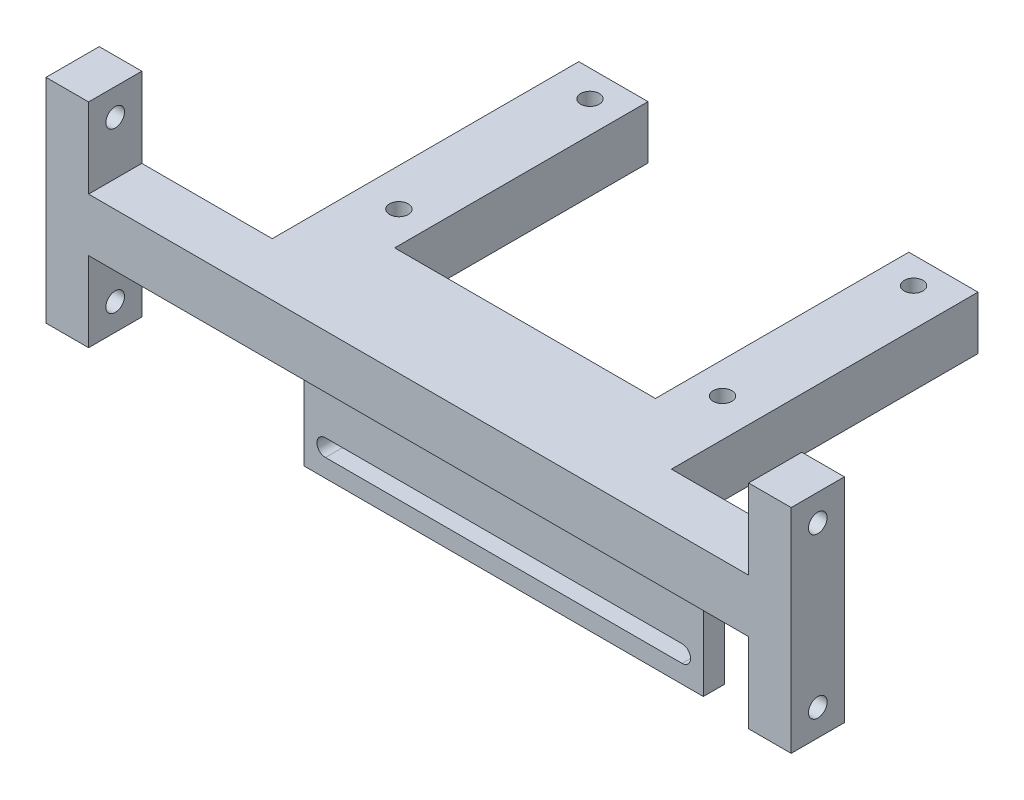
ISO-10303-21;
HEADER;
FILE_DESCRIPTION(('STEP AP214'),'2;1');
FILE_NAME('part.step','',(''),(''),'','','');
FILE_SCHEMA(('AUTOMOTIVE_DESIGN { 1 0 10303 214 1 1 1 1 }'));
ENDSEC;
DATA;
#1=APPLICATION_CONTEXT('core data for automotive mechanical design processes');
#2=APPLICATION_PROTOCOL_DEFINITION('international standard','automotive_design',2000,#1);
#3=PRODUCT_CONTEXT('',#1,'mechanical');
#4=PRODUCT('Part','Part','',(#3));
#5=PRODUCT_RELATED_PRODUCT_CATEGORY('part','',(#4));
#6=PRODUCT_DEFINITION_FORMATION('','',#4);
#7=PRODUCT_DEFINITION_CONTEXT('part definition',#1,'design');
#8=PRODUCT_DEFINITION('design','',#6,#7);
#9=PRODUCT_DEFINITION_SHAPE('','',#8);
#10=(LENGTH_UNIT() NAMED_UNIT(*) SI_UNIT(.MILLI.,.METRE.));
#11=(NAMED_UNIT(*) PLANE_ANGLE_UNIT() SI_UNIT($,.RADIAN.));
#12=(NAMED_UNIT(*) SI_UNIT($,.STERADIAN.) SOLID_ANGLE_UNIT());
#13=UNCERTAINTY_MEASURE_WITH_UNIT(LENGTH_MEASURE(1.E-05),#10,'distance_accuracy_value','');
#14=(GEOMETRIC_REPRESENTATION_CONTEXT(3) GLOBAL_UNCERTAINTY_ASSIGNED_CONTEXT((#13)) GLOBAL_UNIT_ASSIGNED_CONTEXT((#10,
#11,#12)) REPRESENTATION_CONTEXT('',''));
#15=CARTESIAN_POINT('',(0.,0.,0.));
#16=DIRECTION('',(0.,0.,1.));
#17=DIRECTION('',(1.,0.,0.));
#18=AXIS2_PLACEMENT_3D('',#15,#16,#17);
#19=CARTESIAN_POINT('',(0.,0.,60.));
#20=DIRECTION('',(0.,0.,-1.));
#21=DIRECTION('',(-1.,0.,0.));
#22=AXIS2_PLACEMENT_3D('',#19,#20,#21);
#23=PLANE('',#22);
#24=CARTESIAN_POINT('',(33.5,-30.,60.));
#25=DIRECTION('',(0.,0.,-1.));
#26=DIRECTION('',(-1.,0.,0.));
#27=AXIS2_PLACEMENT_3D('',#24,#25,#26);
#28=CIRCLE('',#27,1.6);
#29=CARTESIAN_POINT('',(33.5,-28.4,60.));
#30=VERTEX_POINT('',#29);
#31=CARTESIAN_POINT('',(33.5,-31.6,60.));
#32=VERTEX_POINT('',#31);
#33=EDGE_CURVE('E58',#30,#32,#28,.T.);
#34=ORIENTED_EDGE('',*,*,#33,.F.);
#35=DIRECTION('',(1.,0.,0.));
#36=VECTOR('',#35,1.);
#37=CARTESIAN_POINT('',(33.5,-28.4,60.));
#38=LINE('',#37,#36);
#39=CARTESIAN_POINT('',(-33.5,-28.4,60.));
#40=VERTEX_POINT('',#39);
#41=EDGE_CURVE('E311',#40,#30,#38,.T.);
#42=ORIENTED_EDGE('',*,*,#41,.F.);
#43=CARTESIAN_POINT('',(-33.5,-30.,60.));
#44=DIRECTION('',(0.,0.,-1.));
#45=DIRECTION('',(-1.,0.,0.));
#46=AXIS2_PLACEMENT_3D('',#43,#44,#45);
#47=CIRCLE('',#46,1.6);
#48=CARTESIAN_POINT('',(-33.5,-31.6,60.));
#49=VERTEX_POINT('',#48);
#50=EDGE_CURVE('E308',#49,#40,#47,.T.);
#51=ORIENTED_EDGE('',*,*,#50,.F.);
#52=DIRECTION('',(-1.,0.,0.));
#53=VECTOR('',#52,1.);
#54=CARTESIAN_POINT('',(33.5,-31.6,60.));
#55=LINE('',#54,#53);
#56=EDGE_CURVE('E306',#32,#49,#55,.T.);
#57=ORIENTED_EDGE('',*,*,#56,.F.);
#58=EDGE_LOOP('',(#34,#42,#51,#57));
#59=FACE_BOUND('',#58,.T.);
#60=DIRECTION('',(1.,0.,0.));
#61=VECTOR('',#60,1.);
#62=CARTESIAN_POINT('',(-37.5,-5.,60.));
#63=LINE('',#62,#61);
#64=CARTESIAN_POINT('',(-37.5,-5.,60.));
#65=VERTEX_POINT('',#64);
#66=CARTESIAN_POINT('',(-24.5,-5.,60.));
#67=VERTEX_POINT('',#66);
#68=EDGE_CURVE('E229',#65,#67,#63,.T.);
#69=ORIENTED_EDGE('',*,*,#68,.T.);
#70=DIRECTION('',(0.,-1.,0.));
#71=VECTOR('',#70,1.);
#72=CARTESIAN_POINT('',(-24.5,5.,60.));
#73=LINE('',#72,#71);
#74=CARTESIAN_POINT('',(-24.5,5.,60.));
#75=VERTEX_POINT('',#74);
#76=EDGE_CURVE('E232',#75,#67,#73,.T.);
#77=ORIENTED_EDGE('',*,*,#76,.F.);
#78=DIRECTION('',(1.,0.,0.));
#79=VECTOR('',#78,1.);
#80=CARTESIAN_POINT('',(27.5,5.,60.));
#81=LINE('',#80,#79);
#82=CARTESIAN_POINT('',(24.5,5.,60.));
#83=VERTEX_POINT('',#82);
#84=EDGE_CURVE('E423',#75,#83,#81,.T.);
#85=ORIENTED_EDGE('',*,*,#84,.T.);
#86=DIRECTION('',(0.,1.,0.));
#87=VECTOR('',#86,1.);
#88=CARTESIAN_POINT('',(24.5,-5.,60.));
#89=LINE('',#88,#87);
#90=CARTESIAN_POINT('',(24.5,-5.,60.));
#91=VERTEX_POINT('',#90);
#92=EDGE_CURVE('E258',#91,#83,#89,.T.);
#93=ORIENTED_EDGE('',*,*,#92,.F.);
#94=CARTESIAN_POINT('',(37.5,-5.,60.));
#95=VERTEX_POINT('',#94);
#96=EDGE_CURVE('E239',#91,#95,#63,.T.);
#97=ORIENTED_EDGE('',*,*,#96,.T.);
#98=DIRECTION('',(0.,1.,0.));
#99=VECTOR('',#98,1.);
#100=CARTESIAN_POINT('',(37.5,-35.,60.));
#101=LINE('',#100,#99);
#102=CARTESIAN_POINT('',(37.5,-35.,60.));
#103=VERTEX_POINT('',#102);
#104=EDGE_CURVE('E336',#103,#95,#101,.T.);
#105=ORIENTED_EDGE('',*,*,#104,.F.);
#106=DIRECTION('',(1.,0.,0.));
#107=VECTOR('',#106,1.);
#108=CARTESIAN_POINT('',(-37.5,-35.,60.));
#109=LINE('',#108,#107);
#110=CARTESIAN_POINT('',(-37.5,-35.,60.));
#111=VERTEX_POINT('',#110);
#112=EDGE_CURVE('E324',#111,#103,#109,.T.);
#113=ORIENTED_EDGE('',*,*,#112,.F.);
#114=DIRECTION('',(0.,1.,0.));
#115=VECTOR('',#114,1.);
#116=CARTESIAN_POINT('',(-37.5,-35.,60.));
#117=LINE('',#116,#115);
#118=EDGE_CURVE('E235',#111,#65,#117,.T.);
#119=ORIENTED_EDGE('',*,*,#118,.T.);
#120=EDGE_LOOP('',(#69,#77,#85,#93,#97,#105,#113,#119));
#121=FACE_BOUND('',#120,.T.);
#122=ADVANCED_FACE('F41',(#59,#121),#23,.T.);
#123=CARTESIAN_POINT('',(-70.,-5.,80.));
#124=DIRECTION('',(0.,1.,0.));
#125=DIRECTION('',(0.,0.,1.));
#126=AXIS2_PLACEMENT_3D('',#123,#124,#125);
#127=PLANE('',#126);
#128=CARTESIAN_POINT('',(-30.4,-5.,53.3));
#129=DIRECTION('',(0.,1.,0.));
#130=DIRECTION('',(0.,0.,1.));
#131=AXIS2_PLACEMENT_3D('',#128,#129,#130);
#132=CIRCLE('',#131,1.75);
#133=CARTESIAN_POINT('',(-30.4,-5.,55.05));
#134=VERTEX_POINT('',#133);
#135=EDGE_CURVE('E282',#134,#134,#132,.T.);
#136=ORIENTED_EDGE('',*,*,#135,.T.);
#137=EDGE_LOOP('',(#136));
#138=FACE_BOUND('',#137,.T.);
#139=CARTESIAN_POINT('',(-30.4,-5.,17.4));
#140=DIRECTION('',(0.,1.,0.));
#141=DIRECTION('',(0.,0.,1.));
#142=AXIS2_PLACEMENT_3D('',#139,#140,#141);
#143=CIRCLE('',#142,1.75);
#144=CARTESIAN_POINT('',(-30.4,-5.,19.15));
#145=VERTEX_POINT('',#144);
#146=EDGE_CURVE('E279',#145,#145,#143,.T.);
#147=ORIENTED_EDGE('',*,*,#146,.T.);
#148=EDGE_LOOP('',(#147));
#149=FACE_BOUND('',#148,.T.);
#150=ORIENTED_EDGE('',*,*,#68,.F.);
#151=DIRECTION('',(0.,0.,-1.));
#152=VECTOR('',#151,1.);
#153=CARTESIAN_POINT('',(-37.5,-5.,0.));
#154=LINE('',#153,#152);
#155=CARTESIAN_POINT('',(-37.5,-5.,12.4));
#156=VERTEX_POINT('',#155);
#157=EDGE_CURVE('E428',#65,#156,#154,.T.);
#158=ORIENTED_EDGE('',*,*,#157,.T.);
#159=DIRECTION('',(-1.,0.,0.));
#160=VECTOR('',#159,1.);
#161=CARTESIAN_POINT('',(-27.5,-5.,12.4));
#162=LINE('',#161,#160);
#163=CARTESIAN_POINT('',(-24.5,-5.,12.4));
#164=VERTEX_POINT('',#163);
#165=EDGE_CURVE('E245',#164,#156,#162,.T.);
#166=ORIENTED_EDGE('',*,*,#165,.F.);
#167=DIRECTION('',(0.,0.,-1.));
#168=VECTOR('',#167,1.);
#169=CARTESIAN_POINT('',(-24.5,-5.,60.));
#170=LINE('',#169,#168);
#171=EDGE_CURVE('E242',#67,#164,#170,.T.);
#172=ORIENTED_EDGE('',*,*,#171,.F.);
#173=EDGE_LOOP('',(#150,#158,#166,#172));
#174=FACE_BOUND('',#173,.T.);
#175=ADVANCED_FACE('F243',(#138,#149,#174),#127,.F.);
#176=CARTESIAN_POINT('',(30.4,-5.,17.4));
#177=DIRECTION('',(0.,1.,0.));
#178=DIRECTION('',(0.,0.,1.));
#179=AXIS2_PLACEMENT_3D('',#176,#177,#178);
#180=CIRCLE('',#179,1.75);
#181=CARTESIAN_POINT('',(30.4,-5.,19.15));
#182=VERTEX_POINT('',#181);
#183=EDGE_CURVE('E275',#182,#182,#180,.T.);
#184=ORIENTED_EDGE('',*,*,#183,.T.);
#185=EDGE_LOOP('',(#184));
#186=FACE_BOUND('',#185,.T.);
#187=CARTESIAN_POINT('',(30.4,-5.,53.3));
#188=DIRECTION('',(0.,1.,0.));
#189=DIRECTION('',(0.,0.,1.));
#190=AXIS2_PLACEMENT_3D('',#187,#188,#189);
#191=CIRCLE('',#190,1.75000000000001);
#192=CARTESIAN_POINT('',(30.4,-5.,55.05));
#193=VERTEX_POINT('',#192);
#194=EDGE_CURVE('E271',#193,#193,#191,.T.);
#195=ORIENTED_EDGE('',*,*,#194,.T.);
#196=EDGE_LOOP('',(#195));
#197=FACE_BOUND('',#196,.T.);
#198=ORIENTED_EDGE('',*,*,#96,.F.);
#199=DIRECTION('',(0.,0.,1.));
#200=VECTOR('',#199,1.);
#201=CARTESIAN_POINT('',(24.5,-5.,12.4));
#202=LINE('',#201,#200);
#203=CARTESIAN_POINT('',(24.5,-5.,12.4));
#204=VERTEX_POINT('',#203);
#205=EDGE_CURVE('E267',#204,#91,#202,.T.);
#206=ORIENTED_EDGE('',*,*,#205,.F.);
#207=DIRECTION('',(-1.,0.,0.));
#208=VECTOR('',#207,1.);
#209=CARTESIAN_POINT('',(37.5,-5.,12.4));
#210=LINE('',#209,#208);
#211=CARTESIAN_POINT('',(37.5,-5.,12.4));
#212=VERTEX_POINT('',#211);
#213=EDGE_CURVE('E343',#212,#204,#210,.T.);
#214=ORIENTED_EDGE('',*,*,#213,.F.);
#215=DIRECTION('',(0.,0.,1.));
#216=VECTOR('',#215,1.);
#217=CARTESIAN_POINT('',(37.5,-5.,0.));
#218=LINE('',#217,#216);
#219=EDGE_CURVE('E452',#212,#95,#218,.T.);
#220=ORIENTED_EDGE('',*,*,#219,.T.);
#221=EDGE_LOOP('',(#198,#206,#214,#220));
#222=FACE_BOUND('',#221,.T.);
#223=ADVANCED_FACE('F497',(#186,#197,#222),#127,.F.);
#224=DIRECTION('',(-1.,0.,0.));
#225=VECTOR('',#224,1.);
#226=CARTESIAN_POINT('',(-37.5,-5.,64.));
#227=LINE('',#226,#225);
#228=CARTESIAN_POINT('',(37.5,-5.,64.));
#229=VERTEX_POINT('',#228);
#230=CARTESIAN_POINT('',(-37.5,-5.,64.));
#231=VERTEX_POINT('',#230);
#232=EDGE_CURVE('E238',#229,#231,#227,.T.);
#233=ORIENTED_EDGE('',*,*,#232,.F.);
#234=CARTESIAN_POINT('',(37.5,-5.,70.));
#235=VERTEX_POINT('',#234);
#236=EDGE_CURVE('E456',#229,#235,#218,.T.);
#237=ORIENTED_EDGE('',*,*,#236,.T.);
#238=DIRECTION('',(1.,0.,0.));
#239=VECTOR('',#238,1.);
#240=CARTESIAN_POINT('',(70.,-5.,70.));
#241=LINE('',#240,#239);
#242=CARTESIAN_POINT('',(62.,-5.,70.));
#243=VERTEX_POINT('',#242);
#244=EDGE_CURVE('E447',#235,#243,#241,.T.);
#245=ORIENTED_EDGE('',*,*,#244,.T.);
#246=DIRECTION('',(0.,0.,1.));
#247=VECTOR('',#246,1.);
#248=CARTESIAN_POINT('',(62.,-5.,80.));
#249=LINE('',#248,#247);
#250=CARTESIAN_POINT('',(62.,-5.,80.));
#251=VERTEX_POINT('',#250);
#252=EDGE_CURVE('E418',#243,#251,#249,.T.);
#253=ORIENTED_EDGE('',*,*,#252,.T.);
#254=DIRECTION('',(1.,0.,0.));
#255=VECTOR('',#254,1.);
#256=CARTESIAN_POINT('',(-70.,-5.,80.));
#257=LINE('',#256,#255);
#258=CARTESIAN_POINT('',(-62.,-5.,80.));
#259=VERTEX_POINT('',#258);
#260=EDGE_CURVE('E465',#259,#251,#257,.T.);
#261=ORIENTED_EDGE('',*,*,#260,.F.);
#262=DIRECTION('',(0.,0.,-1.));
#263=VECTOR('',#262,1.);
#264=CARTESIAN_POINT('',(-62.,-5.,80.));
#265=LINE('',#264,#263);
#266=CARTESIAN_POINT('',(-62.,-5.,70.));
#267=VERTEX_POINT('',#266);
#268=EDGE_CURVE('E375',#259,#267,#265,.T.);
#269=ORIENTED_EDGE('',*,*,#268,.T.);
#270=DIRECTION('',(1.,0.,0.));
#271=VECTOR('',#270,1.);
#272=CARTESIAN_POINT('',(-70.,-5.,70.));
#273=LINE('',#272,#271);
#274=CARTESIAN_POINT('',(-37.5,-5.,70.));
#275=VERTEX_POINT('',#274);
#276=EDGE_CURVE('E426',#267,#275,#273,.T.);
#277=ORIENTED_EDGE('',*,*,#276,.T.);
#278=EDGE_CURVE('E430',#275,#231,#154,.T.);
#279=ORIENTED_EDGE('',*,*,#278,.T.);
#280=EDGE_LOOP('',(#233,#237,#245,#253,#261,#269,#277,#279));
#281=FACE_BOUND('',#280,.T.);
#282=ADVANCED_FACE('F500',(#281),#127,.F.);
#283=CARTESIAN_POINT('',(70.,5.,80.));
#284=DIRECTION('',(-1.,0.,0.));
#285=DIRECTION('',(0.,0.,1.));
#286=AXIS2_PLACEMENT_3D('',#283,#284,#285);
#287=PLANE('',#286);
#288=CARTESIAN_POINT('',(70.,15.,75.));
#289=DIRECTION('',(1.,0.,0.));
#290=DIRECTION('',(0.,0.,-1.));
#291=AXIS2_PLACEMENT_3D('',#288,#289,#290);
#292=CIRCLE('',#291,1.75);
#293=CARTESIAN_POINT('',(70.,15.,73.25));
#294=VERTEX_POINT('',#293);
#295=EDGE_CURVE('E286',#294,#294,#292,.T.);
#296=ORIENTED_EDGE('',*,*,#295,.F.);
#297=EDGE_LOOP('',(#296));
#298=FACE_BOUND('',#297,.T.);
#299=CARTESIAN_POINT('',(70.,-15.,75.));
#300=DIRECTION('',(1.,0.,0.));
#301=DIRECTION('',(0.,0.,-1.));
#302=AXIS2_PLACEMENT_3D('',#299,#300,#301);
#303=CIRCLE('',#302,1.75);
#304=CARTESIAN_POINT('',(70.,-15.,73.25));
#305=VERTEX_POINT('',#304);
#306=EDGE_CURVE('E290',#305,#305,#303,.T.);
#307=ORIENTED_EDGE('',*,*,#306,.F.);
#308=EDGE_LOOP('',(#307));
#309=FACE_BOUND('',#308,.T.);
#310=DIRECTION('',(0.,1.,0.));
#311=VECTOR('',#310,1.);
#312=CARTESIAN_POINT('',(70.,5.,80.));
#313=LINE('',#312,#311);
#314=CARTESIAN_POINT('',(70.,-20.,80.));
#315=VERTEX_POINT('',#314);
#316=CARTESIAN_POINT('',(70.,20.,80.));
#317=VERTEX_POINT('',#316);
#318=EDGE_CURVE('E442',#315,#317,#313,.T.);
#319=ORIENTED_EDGE('',*,*,#318,.F.);
#320=DIRECTION('',(0.,0.,-1.));
#321=VECTOR('',#320,1.);
#322=CARTESIAN_POINT('',(70.,-20.,120.792156108742));
#323=LINE('',#322,#321);
#324=CARTESIAN_POINT('',(70.,-20.,70.));
#325=VERTEX_POINT('',#324);
#326=EDGE_CURVE('E412',#315,#325,#323,.T.);
#327=ORIENTED_EDGE('',*,*,#326,.T.);
#328=DIRECTION('',(0.,1.,0.));
#329=VECTOR('',#328,1.);
#330=CARTESIAN_POINT('',(70.,-5.,70.));
#331=LINE('',#330,#329);
#332=CARTESIAN_POINT('',(70.,20.,70.));
#333=VERTEX_POINT('',#332);
#334=EDGE_CURVE('E425',#325,#333,#331,.T.);
#335=ORIENTED_EDGE('',*,*,#334,.T.);
#336=DIRECTION('',(0.,0.,-1.));
#337=VECTOR('',#336,1.);
#338=CARTESIAN_POINT('',(70.,20.,120.792156108742));
#339=LINE('',#338,#337);
#340=EDGE_CURVE('E404',#317,#333,#339,.T.);
#341=ORIENTED_EDGE('',*,*,#340,.F.);
#342=EDGE_LOOP('',(#319,#327,#335,#341));
#343=FACE_BOUND('',#342,.T.);
#344=ADVANCED_FACE('F43',(#298,#309,#343),#287,.F.);
#345=CARTESIAN_POINT('',(-70.,5.,80.));
#346=DIRECTION('',(0.,-1.,0.));
#347=DIRECTION('',(0.,0.,-1.));
#348=AXIS2_PLACEMENT_3D('',#345,#346,#347);
#349=PLANE('',#348);
#350=ORIENTED_EDGE('',*,*,#84,.F.);
#351=DIRECTION('',(0.,0.,1.));
#352=VECTOR('',#351,1.);
#353=CARTESIAN_POINT('',(-24.5,5.,12.4));
#354=LINE('',#353,#352);
#355=CARTESIAN_POINT('',(-24.5,5.,12.4));
#356=VERTEX_POINT('',#355);
#357=EDGE_CURVE('E253',#356,#75,#354,.T.);
#358=ORIENTED_EDGE('',*,*,#357,.F.);
#359=DIRECTION('',(1.,0.,0.));
#360=VECTOR('',#359,1.);
#361=CARTESIAN_POINT('',(-37.5,5.,12.4));
#362=LINE('',#361,#360);
#363=CARTESIAN_POINT('',(-37.5,5.,12.4));
#364=VERTEX_POINT('',#363);
#365=EDGE_CURVE('E341',#364,#356,#362,.T.);
#366=ORIENTED_EDGE('',*,*,#365,.F.);
#367=DIRECTION('',(0.,0.,-1.));
#368=VECTOR('',#367,1.);
#369=CARTESIAN_POINT('',(-37.5,5.,0.));
#370=LINE('',#369,#368);
#371=CARTESIAN_POINT('',(-37.5,5.,70.));
#372=VERTEX_POINT('',#371);
#373=EDGE_CURVE('E429',#372,#364,#370,.T.);
#374=ORIENTED_EDGE('',*,*,#373,.F.);
#375=DIRECTION('',(1.,0.,0.));
#376=VECTOR('',#375,1.);
#377=CARTESIAN_POINT('',(-70.,5.,70.));
#378=LINE('',#377,#376);
#379=CARTESIAN_POINT('',(-62.,5.,70.));
#380=VERTEX_POINT('',#379);
#381=EDGE_CURVE('E434',#380,#372,#378,.T.);
#382=ORIENTED_EDGE('',*,*,#381,.F.);
#383=DIRECTION('',(0.,0.,1.));
#384=VECTOR('',#383,1.);
#385=CARTESIAN_POINT('',(-62.,5.,80.));
#386=LINE('',#385,#384);
#387=CARTESIAN_POINT('',(-62.,5.,80.));
#388=VERTEX_POINT('',#387);
#389=EDGE_CURVE('E384',#380,#388,#386,.T.);
#390=ORIENTED_EDGE('',*,*,#389,.T.);
#391=DIRECTION('',(-1.,0.,0.));
#392=VECTOR('',#391,1.);
#393=CARTESIAN_POINT('',(-70.,5.,80.));
#394=LINE('',#393,#392);
#395=CARTESIAN_POINT('',(62.,5.,80.));
#396=VERTEX_POINT('',#395);
#397=EDGE_CURVE('E460',#396,#388,#394,.T.);
#398=ORIENTED_EDGE('',*,*,#397,.F.);
#399=DIRECTION('',(0.,0.,-1.));
#400=VECTOR('',#399,1.);
#401=CARTESIAN_POINT('',(62.,5.,80.));
#402=LINE('',#401,#400);
#403=CARTESIAN_POINT('',(62.,5.,70.));
#404=VERTEX_POINT('',#403);
#405=EDGE_CURVE('E421',#396,#404,#402,.T.);
#406=ORIENTED_EDGE('',*,*,#405,.T.);
#407=DIRECTION('',(1.,0.,0.));
#408=VECTOR('',#407,1.);
#409=CARTESIAN_POINT('',(70.,5.,70.));
#410=LINE('',#409,#408);
#411=CARTESIAN_POINT('',(37.5,5.,70.));
#412=VERTEX_POINT('',#411);
#413=EDGE_CURVE('E449',#412,#404,#410,.T.);
#414=ORIENTED_EDGE('',*,*,#413,.F.);
#415=DIRECTION('',(0.,0.,1.));
#416=VECTOR('',#415,1.);
#417=CARTESIAN_POINT('',(37.5,5.,0.));
#418=LINE('',#417,#416);
#419=CARTESIAN_POINT('',(37.5,5.,12.4));
#420=VERTEX_POINT('',#419);
#421=EDGE_CURVE('E436',#420,#412,#418,.T.);
#422=ORIENTED_EDGE('',*,*,#421,.F.);
#423=DIRECTION('',(1.,0.,0.));
#424=VECTOR('',#423,1.);
#425=CARTESIAN_POINT('',(27.5,5.,12.4));
#426=LINE('',#425,#424);
#427=CARTESIAN_POINT('',(24.5,5.,12.4));
#428=VERTEX_POINT('',#427);
#429=EDGE_CURVE('E348',#428,#420,#426,.T.);
#430=ORIENTED_EDGE('',*,*,#429,.F.);
#431=DIRECTION('',(0.,0.,-1.));
#432=VECTOR('',#431,1.);
#433=CARTESIAN_POINT('',(24.5,5.,60.));
#434=LINE('',#433,#432);
#435=EDGE_CURVE('E261',#83,#428,#434,.T.);
#436=ORIENTED_EDGE('',*,*,#435,.F.);
#437=EDGE_LOOP('',(#350,#358,#366,#374,#382,#390,#398,#406,#414,#422,#430,#436));
#438=FACE_BOUND('',#437,.T.);
#439=CARTESIAN_POINT('',(-30.4,5.,53.3));
#440=DIRECTION('',(0.,-1.,0.));
#441=DIRECTION('',(0.,0.,-1.));
#442=AXIS2_PLACEMENT_3D('',#439,#440,#441);
#443=CIRCLE('',#442,1.75);
#444=CARTESIAN_POINT('',(-30.4,5.,51.55));
#445=VERTEX_POINT('',#444);
#446=EDGE_CURVE('E45',#445,#445,#443,.T.);
#447=ORIENTED_EDGE('',*,*,#446,.T.);
#448=EDGE_LOOP('',(#447));
#449=FACE_BOUND('',#448,.T.);
#450=CARTESIAN_POINT('',(-30.4,5.,17.4));
#451=DIRECTION('',(0.,-1.,0.));
#452=DIRECTION('',(0.,0.,-1.));
#453=AXIS2_PLACEMENT_3D('',#450,#451,#452);
#454=CIRCLE('',#453,1.75);
#455=CARTESIAN_POINT('',(-30.4,5.,15.65));
#456=VERTEX_POINT('',#455);
#457=EDGE_CURVE('E278',#456,#456,#454,.T.);
#458=ORIENTED_EDGE('',*,*,#457,.T.);
#459=EDGE_LOOP('',(#458));
#460=FACE_BOUND('',#459,.T.);
#461=CARTESIAN_POINT('',(30.4,5.,17.4));
#462=DIRECTION('',(0.,-1.,0.));
#463=DIRECTION('',(0.,0.,-1.));
#464=AXIS2_PLACEMENT_3D('',#461,#462,#463);
#465=CIRCLE('',#464,1.75);
#466=CARTESIAN_POINT('',(30.4,5.,15.65));
#467=VERTEX_POINT('',#466);
#468=EDGE_CURVE('E274',#467,#467,#465,.T.);
#469=ORIENTED_EDGE('',*,*,#468,.T.);
#470=EDGE_LOOP('',(#469));
#471=FACE_BOUND('',#470,.T.);
#472=CARTESIAN_POINT('',(30.4,5.,53.3));
#473=DIRECTION('',(0.,-1.,0.));
#474=DIRECTION('',(0.,0.,-1.));
#475=AXIS2_PLACEMENT_3D('',#472,#473,#474);
#476=CIRCLE('',#475,1.75000000000001);
#477=CARTESIAN_POINT('',(30.4,5.,51.55));
#478=VERTEX_POINT('',#477);
#479=EDGE_CURVE('E270',#478,#478,#476,.T.);
#480=ORIENTED_EDGE('',*,*,#479,.T.);
#481=EDGE_LOOP('',(#480));
#482=FACE_BOUND('',#481,.T.);
#483=ADVANCED_FACE('F485',(#438,#449,#460,#471,#482),#349,.F.);
#484=CARTESIAN_POINT('',(-70.,5.,80.));
#485=DIRECTION('',(1.,0.,0.));
#486=DIRECTION('',(0.,0.,-1.));
#487=AXIS2_PLACEMENT_3D('',#484,#485,#486);
#488=PLANE('',#487);
#489=CARTESIAN_POINT('',(-70.,15.,75.));
#490=DIRECTION('',(1.,0.,0.));
#491=DIRECTION('',(0.,0.,-1.));
#492=AXIS2_PLACEMENT_3D('',#489,#490,#491);
#493=CIRCLE('',#492,1.75);
#494=CARTESIAN_POINT('',(-70.,15.,73.25));
#495=VERTEX_POINT('',#494);
#496=EDGE_CURVE('E289',#495,#495,#493,.T.);
#497=ORIENTED_EDGE('',*,*,#496,.T.);
#498=EDGE_LOOP('',(#497));
#499=FACE_BOUND('',#498,.T.);
#500=CARTESIAN_POINT('',(-70.,-15.,75.));
#501=DIRECTION('',(1.,0.,0.));
#502=DIRECTION('',(0.,0.,-1.));
#503=AXIS2_PLACEMENT_3D('',#500,#501,#502);
#504=CIRCLE('',#503,1.75);
#505=CARTESIAN_POINT('',(-70.,-15.,73.25));
#506=VERTEX_POINT('',#505);
#507=EDGE_CURVE('E285',#506,#506,#504,.T.);
#508=ORIENTED_EDGE('',*,*,#507,.T.);
#509=EDGE_LOOP('',(#508));
#510=FACE_BOUND('',#509,.T.);
#511=DIRECTION('',(0.,-1.,0.));
#512=VECTOR('',#511,1.);
#513=CARTESIAN_POINT('',(-70.,5.,80.));
#514=LINE('',#513,#512);
#515=CARTESIAN_POINT('',(-70.,20.,80.));
#516=VERTEX_POINT('',#515);
#517=CARTESIAN_POINT('',(-70.,-20.,80.));
#518=VERTEX_POINT('',#517);
#519=EDGE_CURVE('E463',#516,#518,#514,.T.);
#520=ORIENTED_EDGE('',*,*,#519,.F.);
#521=DIRECTION('',(0.,0.,-1.));
#522=VECTOR('',#521,1.);
#523=CARTESIAN_POINT('',(-70.,20.,120.792156108742));
#524=LINE('',#523,#522);
#525=CARTESIAN_POINT('',(-70.,20.,70.));
#526=VERTEX_POINT('',#525);
#527=EDGE_CURVE('E359',#516,#526,#524,.T.);
#528=ORIENTED_EDGE('',*,*,#527,.T.);
#529=DIRECTION('',(0.,1.,0.));
#530=VECTOR('',#529,1.);
#531=CARTESIAN_POINT('',(-70.,-5.,70.));
#532=LINE('',#531,#530);
#533=CARTESIAN_POINT('',(-70.,-20.,70.));
#534=VERTEX_POINT('',#533);
#535=EDGE_CURVE('E433',#534,#526,#532,.T.);
#536=ORIENTED_EDGE('',*,*,#535,.F.);
#537=DIRECTION('',(0.,0.,-1.));
#538=VECTOR('',#537,1.);
#539=CARTESIAN_POINT('',(-70.,-20.,120.792156108742));
#540=LINE('',#539,#538);
#541=EDGE_CURVE('E355',#518,#534,#540,.T.);
#542=ORIENTED_EDGE('',*,*,#541,.F.);
#543=EDGE_LOOP('',(#520,#528,#536,#542));
#544=FACE_BOUND('',#543,.T.);
#545=ADVANCED_FACE('F609',(#499,#510,#544),#488,.F.);
#546=CARTESIAN_POINT('',(0.,0.,80.));
#547=DIRECTION('',(0.,0.,1.));
#548=DIRECTION('',(1.,0.,0.));
#549=AXIS2_PLACEMENT_3D('',#546,#547,#548);
#550=PLANE('',#549);
#551=ORIENTED_EDGE('',*,*,#397,.T.);
#552=DIRECTION('',(0.,-1.,0.));
#553=VECTOR('',#552,1.);
#554=CARTESIAN_POINT('',(-62.,20.,80.));
#555=LINE('',#554,#553);
#556=CARTESIAN_POINT('',(-62.,20.,80.));
#557=VERTEX_POINT('',#556);
#558=EDGE_CURVE('E365',#557,#388,#555,.T.);
#559=ORIENTED_EDGE('',*,*,#558,.F.);
#560=DIRECTION('',(1.,0.,0.));
#561=VECTOR('',#560,1.);
#562=CARTESIAN_POINT('',(-62.,20.,80.));
#563=LINE('',#562,#561);
#564=EDGE_CURVE('E362',#516,#557,#563,.T.);
#565=ORIENTED_EDGE('',*,*,#564,.F.);
#566=ORIENTED_EDGE('',*,*,#519,.T.);
#567=DIRECTION('',(-1.,0.,0.));
#568=VECTOR('',#567,1.);
#569=CARTESIAN_POINT('',(-62.,-20.,80.));
#570=LINE('',#569,#568);
#571=CARTESIAN_POINT('',(-62.,-20.,80.));
#572=VERTEX_POINT('',#571);
#573=EDGE_CURVE('E358',#572,#518,#570,.T.);
#574=ORIENTED_EDGE('',*,*,#573,.F.);
#575=EDGE_CURVE('E354',#259,#572,#555,.T.);
#576=ORIENTED_EDGE('',*,*,#575,.F.);
#577=ORIENTED_EDGE('',*,*,#260,.T.);
#578=DIRECTION('',(0.,1.,0.));
#579=VECTOR('',#578,1.);
#580=CARTESIAN_POINT('',(62.,20.,80.));
#581=LINE('',#580,#579);
#582=CARTESIAN_POINT('',(62.,-20.,80.));
#583=VERTEX_POINT('',#582);
#584=EDGE_CURVE('E406',#583,#251,#581,.T.);
#585=ORIENTED_EDGE('',*,*,#584,.F.);
#586=DIRECTION('',(-1.,0.,0.));
#587=VECTOR('',#586,1.);
#588=CARTESIAN_POINT('',(70.,-20.,80.));
#589=LINE('',#588,#587);
#590=EDGE_CURVE('E391',#315,#583,#589,.T.);
#591=ORIENTED_EDGE('',*,*,#590,.F.);
#592=ORIENTED_EDGE('',*,*,#318,.T.);
#593=DIRECTION('',(1.,0.,0.));
#594=VECTOR('',#593,1.);
#595=CARTESIAN_POINT('',(70.,20.,80.));
#596=LINE('',#595,#594);
#597=CARTESIAN_POINT('',(62.,20.,80.));
#598=VERTEX_POINT('',#597);
#599=EDGE_CURVE('E401',#598,#317,#596,.T.);
#600=ORIENTED_EDGE('',*,*,#599,.F.);
#601=EDGE_CURVE('E409',#396,#598,#581,.T.);
#602=ORIENTED_EDGE('',*,*,#601,.F.);
#603=EDGE_LOOP('',(#551,#559,#565,#566,#574,#576,#577,#585,#591,#592,#600,#602));
#604=FACE_BOUND('',#603,.T.);
#605=ADVANCED_FACE('F544',(#604),#550,.T.);
#606=CARTESIAN_POINT('',(70.,-5.,70.));
#607=DIRECTION('',(0.,0.,1.));
#608=DIRECTION('',(1.,0.,0.));
#609=AXIS2_PLACEMENT_3D('',#606,#607,#608);
#610=PLANE('',#609);
#611=ORIENTED_EDGE('',*,*,#413,.T.);
#612=DIRECTION('',(0.,1.,0.));
#613=VECTOR('',#612,1.);
#614=CARTESIAN_POINT('',(62.,20.,70.));
#615=LINE('',#614,#613);
#616=CARTESIAN_POINT('',(62.,20.,70.));
#617=VERTEX_POINT('',#616);
#618=EDGE_CURVE('E395',#404,#617,#615,.T.);
#619=ORIENTED_EDGE('',*,*,#618,.T.);
#620=DIRECTION('',(1.,0.,0.));
#621=VECTOR('',#620,1.);
#622=CARTESIAN_POINT('',(70.,20.,70.));
#623=LINE('',#622,#621);
#624=EDGE_CURVE('E388',#617,#333,#623,.T.);
#625=ORIENTED_EDGE('',*,*,#624,.T.);
#626=ORIENTED_EDGE('',*,*,#334,.F.);
#627=DIRECTION('',(-1.,0.,0.));
#628=VECTOR('',#627,1.);
#629=CARTESIAN_POINT('',(70.,-20.,70.));
#630=LINE('',#629,#628);
#631=CARTESIAN_POINT('',(62.,-20.,70.));
#632=VERTEX_POINT('',#631);
#633=EDGE_CURVE('E387',#325,#632,#630,.T.);
#634=ORIENTED_EDGE('',*,*,#633,.T.);
#635=EDGE_CURVE('E392',#632,#243,#615,.T.);
#636=ORIENTED_EDGE('',*,*,#635,.T.);
#637=ORIENTED_EDGE('',*,*,#244,.F.);
#638=DIRECTION('',(0.,1.,0.));
#639=VECTOR('',#638,1.);
#640=CARTESIAN_POINT('',(37.5,-5.,70.));
#641=LINE('',#640,#639);
#642=EDGE_CURVE('E444',#235,#412,#641,.T.);
#643=ORIENTED_EDGE('',*,*,#642,.T.);
#644=EDGE_LOOP('',(#611,#619,#625,#626,#634,#636,#637,#643));
#645=FACE_BOUND('',#644,.T.);
#646=ADVANCED_FACE('F536',(#645),#610,.F.);
#647=CARTESIAN_POINT('',(37.5,-5.,0.));
#648=DIRECTION('',(-1.,0.,0.));
#649=DIRECTION('',(0.,0.,1.));
#650=AXIS2_PLACEMENT_3D('',#647,#648,#649);
#651=PLANE('',#650);
#652=ORIENTED_EDGE('',*,*,#219,.F.);
#653=DIRECTION('',(0.,-1.,0.));
#654=VECTOR('',#653,1.);
#655=CARTESIAN_POINT('',(37.5,5.,12.4));
#656=LINE('',#655,#654);
#657=EDGE_CURVE('E340',#420,#212,#656,.T.);
#658=ORIENTED_EDGE('',*,*,#657,.F.);
#659=ORIENTED_EDGE('',*,*,#421,.T.);
#660=ORIENTED_EDGE('',*,*,#642,.F.);
#661=ORIENTED_EDGE('',*,*,#236,.F.);
#662=DIRECTION('',(0.,1.,0.));
#663=VECTOR('',#662,1.);
#664=CARTESIAN_POINT('',(37.5,-35.,64.));
#665=LINE('',#664,#663);
#666=CARTESIAN_POINT('',(37.5,-35.,64.));
#667=VERTEX_POINT('',#666);
#668=EDGE_CURVE('E334',#667,#229,#665,.T.);
#669=ORIENTED_EDGE('',*,*,#668,.F.);
#670=DIRECTION('',(0.,0.,1.));
#671=VECTOR('',#670,1.);
#672=CARTESIAN_POINT('',(37.5,-35.,64.));
#673=LINE('',#672,#671);
#674=EDGE_CURVE('E326',#103,#667,#673,.T.);
#675=ORIENTED_EDGE('',*,*,#674,.F.);
#676=ORIENTED_EDGE('',*,*,#104,.T.);
#677=EDGE_LOOP('',(#652,#658,#659,#660,#661,#669,#675,#676));
#678=FACE_BOUND('',#677,.T.);
#679=ADVANCED_FACE('F528',(#678),#651,.F.);
#680=CARTESIAN_POINT('',(-37.5,-5.,0.));
#681=DIRECTION('',(1.,0.,0.));
#682=DIRECTION('',(0.,0.,-1.));
#683=AXIS2_PLACEMENT_3D('',#680,#681,#682);
#684=PLANE('',#683);
#685=ORIENTED_EDGE('',*,*,#373,.T.);
#686=DIRECTION('',(0.,1.,0.));
#687=VECTOR('',#686,1.);
#688=CARTESIAN_POINT('',(-37.5,-5.,12.4));
#689=LINE('',#688,#687);
#690=EDGE_CURVE('E344',#156,#364,#689,.T.);
#691=ORIENTED_EDGE('',*,*,#690,.F.);
#692=ORIENTED_EDGE('',*,*,#157,.F.);
#693=ORIENTED_EDGE('',*,*,#118,.F.);
#694=DIRECTION('',(0.,0.,-1.));
#695=VECTOR('',#694,1.);
#696=CARTESIAN_POINT('',(-37.5,-35.,64.));
#697=LINE('',#696,#695);
#698=CARTESIAN_POINT('',(-37.5,-35.,64.));
#699=VERTEX_POINT('',#698);
#700=EDGE_CURVE('E321',#699,#111,#697,.T.);
#701=ORIENTED_EDGE('',*,*,#700,.F.);
#702=DIRECTION('',(0.,1.,0.));
#703=VECTOR('',#702,1.);
#704=CARTESIAN_POINT('',(-37.5,-35.,64.));
#705=LINE('',#704,#703);
#706=EDGE_CURVE('E329',#699,#231,#705,.T.);
#707=ORIENTED_EDGE('',*,*,#706,.T.);
#708=ORIENTED_EDGE('',*,*,#278,.F.);
#709=DIRECTION('',(0.,1.,0.));
#710=VECTOR('',#709,1.);
#711=CARTESIAN_POINT('',(-37.5,-5.,70.));
#712=LINE('',#711,#710);
#713=EDGE_CURVE('E439',#275,#372,#712,.T.);
#714=ORIENTED_EDGE('',*,*,#713,.T.);
#715=EDGE_LOOP('',(#685,#691,#692,#693,#701,#707,#708,#714));
#716=FACE_BOUND('',#715,.T.);
#717=ADVANCED_FACE('F559',(#716),#684,.F.);
#718=CARTESIAN_POINT('',(-70.,-5.,70.));
#719=DIRECTION('',(0.,0.,1.));
#720=DIRECTION('',(1.,0.,0.));
#721=AXIS2_PLACEMENT_3D('',#718,#719,#720);
#722=PLANE('',#721);
#723=ORIENTED_EDGE('',*,*,#276,.F.);
#724=DIRECTION('',(0.,-1.,0.));
#725=VECTOR('',#724,1.);
#726=CARTESIAN_POINT('',(-62.,20.,70.));
#727=LINE('',#726,#725);
#728=CARTESIAN_POINT('',(-62.,-20.,70.));
#729=VERTEX_POINT('',#728);
#730=EDGE_CURVE('E376',#267,#729,#727,.T.);
#731=ORIENTED_EDGE('',*,*,#730,.T.);
#732=DIRECTION('',(-1.,0.,0.));
#733=VECTOR('',#732,1.);
#734=CARTESIAN_POINT('',(-62.,-20.,70.));
#735=LINE('',#734,#733);
#736=EDGE_CURVE('E377',#729,#534,#735,.T.);
#737=ORIENTED_EDGE('',*,*,#736,.T.);
#738=ORIENTED_EDGE('',*,*,#535,.T.);
#739=DIRECTION('',(1.,0.,0.));
#740=VECTOR('',#739,1.);
#741=CARTESIAN_POINT('',(-62.,20.,70.));
#742=LINE('',#741,#740);
#743=CARTESIAN_POINT('',(-62.,20.,70.));
#744=VERTEX_POINT('',#743);
#745=EDGE_CURVE('E371',#526,#744,#742,.T.);
#746=ORIENTED_EDGE('',*,*,#745,.T.);
#747=EDGE_CURVE('E372',#744,#380,#727,.T.);
#748=ORIENTED_EDGE('',*,*,#747,.T.);
#749=ORIENTED_EDGE('',*,*,#381,.T.);
#750=ORIENTED_EDGE('',*,*,#713,.F.);
#751=EDGE_LOOP('',(#723,#731,#737,#738,#746,#748,#749,#750));
#752=FACE_BOUND('',#751,.T.);
#753=ADVANCED_FACE('F555',(#752),#722,.F.);
#754=CARTESIAN_POINT('',(70.,-20.,120.792156108742));
#755=DIRECTION('',(0.,-1.,0.));
#756=DIRECTION('',(0.,0.,-1.));
#757=AXIS2_PLACEMENT_3D('',#754,#755,#756);
#758=PLANE('',#757);
#759=ORIENTED_EDGE('',*,*,#326,.F.);
#760=ORIENTED_EDGE('',*,*,#590,.T.);
#761=DIRECTION('',(0.,0.,-1.));
#762=VECTOR('',#761,1.);
#763=CARTESIAN_POINT('',(62.,-20.,120.792156108742));
#764=LINE('',#763,#762);
#765=EDGE_CURVE('E400',#583,#632,#764,.T.);
#766=ORIENTED_EDGE('',*,*,#765,.T.);
#767=ORIENTED_EDGE('',*,*,#633,.F.);
#768=EDGE_LOOP('',(#759,#760,#766,#767));
#769=FACE_BOUND('',#768,.T.);
#770=ADVANCED_FACE('F591',(#769),#758,.T.);
#771=CARTESIAN_POINT('',(62.,20.,120.792156108742));
#772=DIRECTION('',(-1.,0.,0.));
#773=DIRECTION('',(0.,0.,1.));
#774=AXIS2_PLACEMENT_3D('',#771,#772,#773);
#775=PLANE('',#774);
#776=CARTESIAN_POINT('',(62.,-15.,75.));
#777=DIRECTION('',(-1.,0.,0.));
#778=DIRECTION('',(0.,0.,1.));
#779=AXIS2_PLACEMENT_3D('',#776,#777,#778);
#780=CIRCLE('',#779,1.75);
#781=CARTESIAN_POINT('',(62.,-15.,76.75));
#782=VERTEX_POINT('',#781);
#783=EDGE_CURVE('E302',#782,#782,#780,.T.);
#784=ORIENTED_EDGE('',*,*,#783,.F.);
#785=EDGE_LOOP('',(#784));
#786=FACE_BOUND('',#785,.T.);
#787=ORIENTED_EDGE('',*,*,#252,.F.);
#788=ORIENTED_EDGE('',*,*,#635,.F.);
#789=ORIENTED_EDGE('',*,*,#765,.F.);
#790=ORIENTED_EDGE('',*,*,#584,.T.);
#791=EDGE_LOOP('',(#787,#788,#789,#790));
#792=FACE_BOUND('',#791,.T.);
#793=ADVANCED_FACE('F540',(#786,#792),#775,.T.);
#794=CARTESIAN_POINT('',(62.,15.,75.));
#795=DIRECTION('',(-1.,0.,0.));
#796=DIRECTION('',(0.,0.,1.));
#797=AXIS2_PLACEMENT_3D('',#794,#795,#796);
#798=CIRCLE('',#797,1.75);
#799=CARTESIAN_POINT('',(62.,15.,76.75));
#800=VERTEX_POINT('',#799);
#801=EDGE_CURVE('E298',#800,#800,#798,.T.);
#802=ORIENTED_EDGE('',*,*,#801,.F.);
#803=EDGE_LOOP('',(#802));
#804=FACE_BOUND('',#803,.T.);
#805=ORIENTED_EDGE('',*,*,#405,.F.);
#806=ORIENTED_EDGE('',*,*,#601,.T.);
#807=DIRECTION('',(0.,0.,-1.));
#808=VECTOR('',#807,1.);
#809=CARTESIAN_POINT('',(62.,20.,120.792156108742));
#810=LINE('',#809,#808);
#811=EDGE_CURVE('E405',#598,#617,#810,.T.);
#812=ORIENTED_EDGE('',*,*,#811,.T.);
#813=ORIENTED_EDGE('',*,*,#618,.F.);
#814=EDGE_LOOP('',(#805,#806,#812,#813));
#815=FACE_BOUND('',#814,.T.);
#816=ADVANCED_FACE('F580',(#804,#815),#775,.T.);
#817=CARTESIAN_POINT('',(70.,20.,120.792156108742));
#818=DIRECTION('',(0.,1.,0.));
#819=DIRECTION('',(0.,0.,1.));
#820=AXIS2_PLACEMENT_3D('',#817,#818,#819);
#821=PLANE('',#820);
#822=ORIENTED_EDGE('',*,*,#811,.F.);
#823=ORIENTED_EDGE('',*,*,#599,.T.);
#824=ORIENTED_EDGE('',*,*,#340,.T.);
#825=ORIENTED_EDGE('',*,*,#624,.F.);
#826=EDGE_LOOP('',(#822,#823,#824,#825));
#827=FACE_BOUND('',#826,.T.);
#828=ADVANCED_FACE('F586',(#827),#821,.T.);
#829=CARTESIAN_POINT('',(-62.,-20.,120.792156108742));
#830=DIRECTION('',(0.,-1.,0.));
#831=DIRECTION('',(0.,0.,-1.));
#832=AXIS2_PLACEMENT_3D('',#829,#830,#831);
#833=PLANE('',#832);
#834=DIRECTION('',(0.,0.,-1.));
#835=VECTOR('',#834,1.);
#836=CARTESIAN_POINT('',(-62.,-20.,120.792156108742));
#837=LINE('',#836,#835);
#838=EDGE_CURVE('E346',#572,#729,#837,.T.);
#839=ORIENTED_EDGE('',*,*,#838,.F.);
#840=ORIENTED_EDGE('',*,*,#573,.T.);
#841=ORIENTED_EDGE('',*,*,#541,.T.);
#842=ORIENTED_EDGE('',*,*,#736,.F.);
#843=EDGE_LOOP('',(#839,#840,#841,#842));
#844=FACE_BOUND('',#843,.T.);
#845=ADVANCED_FACE('F629',(#844),#833,.T.);
#846=CARTESIAN_POINT('',(-62.,20.,120.792156108742));
#847=DIRECTION('',(1.,0.,0.));
#848=DIRECTION('',(0.,0.,-1.));
#849=AXIS2_PLACEMENT_3D('',#846,#847,#848);
#850=PLANE('',#849);
#851=CARTESIAN_POINT('',(-62.,-15.,75.));
#852=DIRECTION('',(1.,0.,0.));
#853=DIRECTION('',(0.,0.,-1.));
#854=AXIS2_PLACEMENT_3D('',#851,#852,#853);
#855=CIRCLE('',#854,1.75);
#856=CARTESIAN_POINT('',(-62.,-15.,73.25));
#857=VERTEX_POINT('',#856);
#858=EDGE_CURVE('E301',#857,#857,#855,.T.);
#859=ORIENTED_EDGE('',*,*,#858,.F.);
#860=EDGE_LOOP('',(#859));
#861=FACE_BOUND('',#860,.T.);
#862=ORIENTED_EDGE('',*,*,#268,.F.);
#863=ORIENTED_EDGE('',*,*,#575,.T.);
#864=ORIENTED_EDGE('',*,*,#838,.T.);
#865=ORIENTED_EDGE('',*,*,#730,.F.);
#866=EDGE_LOOP('',(#862,#863,#864,#865));
#867=FACE_BOUND('',#866,.T.);
#868=ADVANCED_FACE('F550',(#861,#867),#850,.T.);
#869=CARTESIAN_POINT('',(-62.,15.,75.));
#870=DIRECTION('',(1.,0.,0.));
#871=DIRECTION('',(0.,0.,-1.));
#872=AXIS2_PLACEMENT_3D('',#869,#870,#871);
#873=CIRCLE('',#872,1.75);
#874=CARTESIAN_POINT('',(-62.,15.,73.25));
#875=VERTEX_POINT('',#874);
#876=EDGE_CURVE('E293',#875,#875,#873,.T.);
#877=ORIENTED_EDGE('',*,*,#876,.F.);
#878=EDGE_LOOP('',(#877));
#879=FACE_BOUND('',#878,.T.);
#880=ORIENTED_EDGE('',*,*,#389,.F.);
#881=ORIENTED_EDGE('',*,*,#747,.F.);
#882=DIRECTION('',(0.,0.,-1.));
#883=VECTOR('',#882,1.);
#884=CARTESIAN_POINT('',(-62.,20.,120.792156108742));
#885=LINE('',#884,#883);
#886=EDGE_CURVE('E363',#557,#744,#885,.T.);
#887=ORIENTED_EDGE('',*,*,#886,.F.);
#888=ORIENTED_EDGE('',*,*,#558,.T.);
#889=EDGE_LOOP('',(#880,#881,#887,#888));
#890=FACE_BOUND('',#889,.T.);
#891=ADVANCED_FACE('F635',(#879,#890),#850,.T.);
#892=CARTESIAN_POINT('',(-62.,20.,120.792156108742));
#893=DIRECTION('',(0.,1.,0.));
#894=DIRECTION('',(0.,0.,1.));
#895=AXIS2_PLACEMENT_3D('',#892,#893,#894);
#896=PLANE('',#895);
#897=ORIENTED_EDGE('',*,*,#527,.F.);
#898=ORIENTED_EDGE('',*,*,#564,.T.);
#899=ORIENTED_EDGE('',*,*,#886,.T.);
#900=ORIENTED_EDGE('',*,*,#745,.F.);
#901=EDGE_LOOP('',(#897,#898,#899,#900));
#902=FACE_BOUND('',#901,.T.);
#903=ADVANCED_FACE('F626',(#902),#896,.T.);
#904=CARTESIAN_POINT('',(-37.5,25.,12.4));
#905=DIRECTION('',(0.,0.,1.));
#906=DIRECTION('',(0.,-1.,0.));
#907=AXIS2_PLACEMENT_3D('',#904,#905,#906);
#908=PLANE('',#907);
#909=ORIENTED_EDGE('',*,*,#690,.T.);
#910=ORIENTED_EDGE('',*,*,#365,.T.);
#911=DIRECTION('',(0.,1.,0.));
#912=VECTOR('',#911,1.);
#913=CARTESIAN_POINT('',(-24.5,-5.,12.4));
#914=LINE('',#913,#912);
#915=EDGE_CURVE('E249',#164,#356,#914,.T.);
#916=ORIENTED_EDGE('',*,*,#915,.F.);
#917=ORIENTED_EDGE('',*,*,#165,.T.);
#918=EDGE_LOOP('',(#909,#910,#916,#917));
#919=FACE_BOUND('',#918,.T.);
#920=ADVANCED_FACE('F641',(#919),#908,.F.);
#921=CARTESIAN_POINT('',(-37.5,25.,12.4));
#922=DIRECTION('',(0.,0.,1.));
#923=DIRECTION('',(0.,-1.,0.));
#924=AXIS2_PLACEMENT_3D('',#921,#922,#923);
#925=PLANE('',#924);
#926=ORIENTED_EDGE('',*,*,#657,.T.);
#927=ORIENTED_EDGE('',*,*,#213,.T.);
#928=DIRECTION('',(0.,-1.,0.));
#929=VECTOR('',#928,1.);
#930=CARTESIAN_POINT('',(24.5,5.,12.4));
#931=LINE('',#930,#929);
#932=EDGE_CURVE('E264',#428,#204,#931,.T.);
#933=ORIENTED_EDGE('',*,*,#932,.F.);
#934=ORIENTED_EDGE('',*,*,#429,.T.);
#935=EDGE_LOOP('',(#926,#927,#933,#934));
#936=FACE_BOUND('',#935,.T.);
#937=ADVANCED_FACE('F570',(#936),#925,.F.);
#938=CARTESIAN_POINT('',(-37.5,-35.,64.));
#939=DIRECTION('',(0.,0.,-1.));
#940=DIRECTION('',(-1.,0.,0.));
#941=AXIS2_PLACEMENT_3D('',#938,#939,#940);
#942=PLANE('',#941);
#943=DIRECTION('',(1.,0.,0.));
#944=VECTOR('',#943,1.);
#945=CARTESIAN_POINT('',(-37.5,-28.4,64.));
#946=LINE('',#945,#944);
#947=CARTESIAN_POINT('',(-33.5,-28.4,64.));
#948=VERTEX_POINT('',#947);
#949=CARTESIAN_POINT('',(33.5,-28.4,64.));
#950=VERTEX_POINT('',#949);
#951=EDGE_CURVE('E50',#948,#950,#946,.T.);
#952=ORIENTED_EDGE('',*,*,#951,.T.);
#953=CARTESIAN_POINT('',(33.5,-30.,64.));
#954=DIRECTION('',(0.,0.,-1.));
#955=DIRECTION('',(-1.,0.,0.));
#956=AXIS2_PLACEMENT_3D('',#953,#954,#955);
#957=CIRCLE('',#956,1.6);
#958=CARTESIAN_POINT('',(33.5,-31.6,64.));
#959=VERTEX_POINT('',#958);
#960=EDGE_CURVE('E11',#950,#959,#957,.T.);
#961=ORIENTED_EDGE('',*,*,#960,.T.);
#962=DIRECTION('',(-1.,0.,0.));
#963=VECTOR('',#962,1.);
#964=CARTESIAN_POINT('',(-37.5,-31.6,64.));
#965=LINE('',#964,#963);
#966=CARTESIAN_POINT('',(-33.5,-31.6,64.));
#967=VERTEX_POINT('',#966);
#968=EDGE_CURVE('E467',#959,#967,#965,.T.);
#969=ORIENTED_EDGE('',*,*,#968,.T.);
#970=CARTESIAN_POINT('',(-33.5,-30.,64.));
#971=DIRECTION('',(0.,0.,-1.));
#972=DIRECTION('',(-1.,0.,0.));
#973=AXIS2_PLACEMENT_3D('',#970,#971,#972);
#974=CIRCLE('',#973,1.6);
#975=EDGE_CURVE('E470',#967,#948,#974,.T.);
#976=ORIENTED_EDGE('',*,*,#975,.T.);
#977=EDGE_LOOP('',(#952,#961,#969,#976));
#978=FACE_BOUND('',#977,.T.);
#979=ORIENTED_EDGE('',*,*,#232,.T.);
#980=ORIENTED_EDGE('',*,*,#706,.F.);
#981=DIRECTION('',(-1.,0.,0.));
#982=VECTOR('',#981,1.);
#983=CARTESIAN_POINT('',(-37.5,-35.,64.));
#984=LINE('',#983,#982);
#985=EDGE_CURVE('E328',#667,#699,#984,.T.);
#986=ORIENTED_EDGE('',*,*,#985,.F.);
#987=ORIENTED_EDGE('',*,*,#668,.T.);
#988=EDGE_LOOP('',(#979,#980,#986,#987));
#989=FACE_BOUND('',#988,.T.);
#990=ADVANCED_FACE('F561',(#978,#989),#942,.F.);
#991=CARTESIAN_POINT('',(0.,-35.,0.));
#992=DIRECTION('',(0.,-1.,0.));
#993=DIRECTION('',(0.,0.,-1.));
#994=AXIS2_PLACEMENT_3D('',#991,#992,#993);
#995=PLANE('',#994);
#996=ORIENTED_EDGE('',*,*,#700,.T.);
#997=ORIENTED_EDGE('',*,*,#112,.T.);
#998=ORIENTED_EDGE('',*,*,#674,.T.);
#999=ORIENTED_EDGE('',*,*,#985,.T.);
#1000=EDGE_LOOP('',(#996,#997,#998,#999));
#1001=FACE_BOUND('',#1000,.T.);
#1002=ADVANCED_FACE('F563',(#1001),#995,.T.);
#1003=CARTESIAN_POINT('',(33.5,-30.,87.));
#1004=DIRECTION('',(0.,0.,-1.));
#1005=DIRECTION('',(-1.,0.,0.));
#1006=AXIS2_PLACEMENT_3D('',#1003,#1004,#1005);
#1007=CYLINDRICAL_SURFACE('',#1006,1.6);
#1008=DIRECTION('',(0.,0.,-1.));
#1009=VECTOR('',#1008,1.);
#1010=CARTESIAN_POINT('',(33.5,-28.4,87.));
#1011=LINE('',#1010,#1009);
#1012=EDGE_CURVE('E315',#950,#30,#1011,.T.);
#1013=ORIENTED_EDGE('',*,*,#1012,.T.);
#1014=ORIENTED_EDGE('',*,*,#33,.T.);
#1015=DIRECTION('',(0.,0.,-1.));
#1016=VECTOR('',#1015,1.);
#1017=CARTESIAN_POINT('',(33.5,-31.6,87.));
#1018=LINE('',#1017,#1016);
#1019=EDGE_CURVE('E314',#959,#32,#1018,.T.);
#1020=ORIENTED_EDGE('',*,*,#1019,.F.);
#1021=ORIENTED_EDGE('',*,*,#960,.F.);
#1022=EDGE_LOOP('',(#1013,#1014,#1020,#1021));
#1023=FACE_BOUND('',#1022,.T.);
#1024=ADVANCED_FACE('F663',(#1023),#1007,.F.);
#1025=CARTESIAN_POINT('',(33.5,-28.4,87.));
#1026=DIRECTION('',(0.,1.,0.));
#1027=DIRECTION('',(0.,0.,1.));
#1028=AXIS2_PLACEMENT_3D('',#1025,#1026,#1027);
#1029=PLANE('',#1028);
#1030=DIRECTION('',(0.,0.,-1.));
#1031=VECTOR('',#1030,1.);
#1032=CARTESIAN_POINT('',(-33.5,-28.4,87.));
#1033=LINE('',#1032,#1031);
#1034=EDGE_CURVE('E317',#948,#40,#1033,.T.);
#1035=ORIENTED_EDGE('',*,*,#1034,.T.);
#1036=ORIENTED_EDGE('',*,*,#41,.T.);
#1037=ORIENTED_EDGE('',*,*,#1012,.F.);
#1038=ORIENTED_EDGE('',*,*,#951,.F.);
#1039=EDGE_LOOP('',(#1035,#1036,#1037,#1038));
#1040=FACE_BOUND('',#1039,.T.);
#1041=ADVANCED_FACE('F666',(#1040),#1029,.F.);
#1042=CARTESIAN_POINT('',(-33.5,-30.,87.));
#1043=DIRECTION('',(0.,0.,-1.));
#1044=DIRECTION('',(-1.,0.,0.));
#1045=AXIS2_PLACEMENT_3D('',#1042,#1043,#1044);
#1046=CYLINDRICAL_SURFACE('',#1045,1.6);
#1047=DIRECTION('',(0.,0.,-1.));
#1048=VECTOR('',#1047,1.);
#1049=CARTESIAN_POINT('',(-33.5,-31.6,87.));
#1050=LINE('',#1049,#1048);
#1051=EDGE_CURVE('E66',#967,#49,#1050,.T.);
#1052=ORIENTED_EDGE('',*,*,#1051,.T.);
#1053=ORIENTED_EDGE('',*,*,#50,.T.);
#1054=ORIENTED_EDGE('',*,*,#1034,.F.);
#1055=ORIENTED_EDGE('',*,*,#975,.F.);
#1056=EDGE_LOOP('',(#1052,#1053,#1054,#1055));
#1057=FACE_BOUND('',#1056,.T.);
#1058=ADVANCED_FACE('F671',(#1057),#1046,.F.);
#1059=CARTESIAN_POINT('',(33.5,-31.6,87.));
#1060=DIRECTION('',(0.,-1.,0.));
#1061=DIRECTION('',(0.,0.,-1.));
#1062=AXIS2_PLACEMENT_3D('',#1059,#1060,#1061);
#1063=PLANE('',#1062);
#1064=ORIENTED_EDGE('',*,*,#1019,.T.);
#1065=ORIENTED_EDGE('',*,*,#56,.T.);
#1066=ORIENTED_EDGE('',*,*,#1051,.F.);
#1067=ORIENTED_EDGE('',*,*,#968,.F.);
#1068=EDGE_LOOP('',(#1064,#1065,#1066,#1067));
#1069=FACE_BOUND('',#1068,.T.);
#1070=ADVANCED_FACE('F667',(#1069),#1063,.F.);
#1071=CARTESIAN_POINT('',(-70.,15.,75.));
#1072=DIRECTION('',(1.,0.,0.));
#1073=DIRECTION('',(0.,0.,-1.));
#1074=AXIS2_PLACEMENT_3D('',#1071,#1072,#1073);
#1075=CYLINDRICAL_SURFACE('',#1074,1.75);
#1076=ORIENTED_EDGE('',*,*,#876,.T.);
#1077=EDGE_LOOP('',(#1076));
#1078=FACE_BOUND('',#1077,.T.);
#1079=ORIENTED_EDGE('',*,*,#496,.F.);
#1080=EDGE_LOOP('',(#1079));
#1081=FACE_BOUND('',#1080,.T.);
#1082=ADVANCED_FACE('F670',(#1078,#1081),#1075,.F.);
#1083=CARTESIAN_POINT('',(-70.,-15.,75.));
#1084=DIRECTION('',(1.,0.,0.));
#1085=DIRECTION('',(0.,0.,-1.));
#1086=AXIS2_PLACEMENT_3D('',#1083,#1084,#1085);
#1087=CYLINDRICAL_SURFACE('',#1086,1.75);
#1088=ORIENTED_EDGE('',*,*,#858,.T.);
#1089=EDGE_LOOP('',(#1088));
#1090=FACE_BOUND('',#1089,.T.);
#1091=ORIENTED_EDGE('',*,*,#507,.F.);
#1092=EDGE_LOOP('',(#1091));
#1093=FACE_BOUND('',#1092,.T.);
#1094=ADVANCED_FACE('F678',(#1090,#1093),#1087,.F.);
#1095=ORIENTED_EDGE('',*,*,#801,.T.);
#1096=EDGE_LOOP('',(#1095));
#1097=FACE_BOUND('',#1096,.T.);
#1098=ORIENTED_EDGE('',*,*,#295,.T.);
#1099=EDGE_LOOP('',(#1098));
#1100=FACE_BOUND('',#1099,.T.);
#1101=ADVANCED_FACE('F681',(#1097,#1100),#1075,.F.);
#1102=ORIENTED_EDGE('',*,*,#783,.T.);
#1103=EDGE_LOOP('',(#1102));
#1104=FACE_BOUND('',#1103,.T.);
#1105=ORIENTED_EDGE('',*,*,#306,.T.);
#1106=EDGE_LOOP('',(#1105));
#1107=FACE_BOUND('',#1106,.T.);
#1108=ADVANCED_FACE('F683',(#1104,#1107),#1087,.F.);
#1109=CARTESIAN_POINT('',(30.4,-35.,53.3));
#1110=DIRECTION('',(0.,1.,0.));
#1111=DIRECTION('',(0.,0.,1.));
#1112=AXIS2_PLACEMENT_3D('',#1109,#1110,#1111);
#1113=CYLINDRICAL_SURFACE('',#1112,1.75000000000001);
#1114=ORIENTED_EDGE('',*,*,#479,.F.);
#1115=EDGE_LOOP('',(#1114));
#1116=FACE_BOUND('',#1115,.T.);
#1117=ORIENTED_EDGE('',*,*,#194,.F.);
#1118=EDGE_LOOP('',(#1117));
#1119=FACE_BOUND('',#1118,.T.);
#1120=ADVANCED_FACE('F686',(#1116,#1119),#1113,.F.);
#1121=CARTESIAN_POINT('',(30.4,-35.,17.4));
#1122=DIRECTION('',(0.,1.,0.));
#1123=DIRECTION('',(0.,0.,1.));
#1124=AXIS2_PLACEMENT_3D('',#1121,#1122,#1123);
#1125=CYLINDRICAL_SURFACE('',#1124,1.75);
#1126=ORIENTED_EDGE('',*,*,#468,.F.);
#1127=EDGE_LOOP('',(#1126));
#1128=FACE_BOUND('',#1127,.T.);
#1129=ORIENTED_EDGE('',*,*,#183,.F.);
#1130=EDGE_LOOP('',(#1129));
#1131=FACE_BOUND('',#1130,.T.);
#1132=ADVANCED_FACE('F492',(#1128,#1131),#1125,.F.);
#1133=CARTESIAN_POINT('',(-30.4,-35.,17.4));
#1134=DIRECTION('',(0.,1.,0.));
#1135=DIRECTION('',(0.,0.,1.));
#1136=AXIS2_PLACEMENT_3D('',#1133,#1134,#1135);
#1137=CYLINDRICAL_SURFACE('',#1136,1.75);
#1138=ORIENTED_EDGE('',*,*,#457,.F.);
#1139=EDGE_LOOP('',(#1138));
#1140=FACE_BOUND('',#1139,.T.);
#1141=ORIENTED_EDGE('',*,*,#146,.F.);
#1142=EDGE_LOOP('',(#1141));
#1143=FACE_BOUND('',#1142,.T.);
#1144=ADVANCED_FACE('F488',(#1140,#1143),#1137,.F.);
#1145=CARTESIAN_POINT('',(-30.4,-35.,53.3));
#1146=DIRECTION('',(0.,1.,0.));
#1147=DIRECTION('',(0.,0.,1.));
#1148=AXIS2_PLACEMENT_3D('',#1145,#1146,#1147);
#1149=CYLINDRICAL_SURFACE('',#1148,1.75);
#1150=ORIENTED_EDGE('',*,*,#446,.F.);
#1151=EDGE_LOOP('',(#1150));
#1152=FACE_BOUND('',#1151,.T.);
#1153=ORIENTED_EDGE('',*,*,#135,.F.);
#1154=EDGE_LOOP('',(#1153));
#1155=FACE_BOUND('',#1154,.T.);
#1156=ADVANCED_FACE('F491',(#1152,#1155),#1149,.F.);
#1157=CARTESIAN_POINT('',(24.5,0.,0.));
#1158=DIRECTION('',(-1.,0.,0.));
#1159=DIRECTION('',(0.,0.,1.));
#1160=AXIS2_PLACEMENT_3D('',#1157,#1158,#1159);
#1161=PLANE('',#1160);
#1162=ORIENTED_EDGE('',*,*,#92,.T.);
#1163=ORIENTED_EDGE('',*,*,#435,.T.);
#1164=ORIENTED_EDGE('',*,*,#932,.T.);
#1165=ORIENTED_EDGE('',*,*,#205,.T.);
#1166=EDGE_LOOP('',(#1162,#1163,#1164,#1165));
#1167=FACE_BOUND('',#1166,.T.);
#1168=ADVANCED_FACE('F572',(#1167),#1161,.T.);
#1169=CARTESIAN_POINT('',(-24.5,0.,0.));
#1170=DIRECTION('',(1.,0.,0.));
#1171=DIRECTION('',(0.,1.,0.));
#1172=AXIS2_PLACEMENT_3D('',#1169,#1170,#1171);
#1173=PLANE('',#1172);
#1174=ORIENTED_EDGE('',*,*,#76,.T.);
#1175=ORIENTED_EDGE('',*,*,#171,.T.);
#1176=ORIENTED_EDGE('',*,*,#915,.T.);
#1177=ORIENTED_EDGE('',*,*,#357,.T.);
#1178=EDGE_LOOP('',(#1174,#1175,#1176,#1177));
#1179=FACE_BOUND('',#1178,.T.);
#1180=ADVANCED_FACE('F251',(#1179),#1173,.T.);
#1181=CLOSED_SHELL('',(#122,#175,#223,#282,#344,#483,#545,#605,#646,#679,#717,#753,#770,#793,
#816,#828,#845,#868,#891,#903,#920,#937,#990,#1002,#1024,#1041,#1058,#1070,#1082,#1094,#1101,
#1108,#1120,#1132,#1144,#1156,#1168,#1180));
#1182=MANIFOLD_SOLID_BREP('B2',#1181);
#1183=ADVANCED_BREP_SHAPE_REPRESENTATION('',(#18,#1182),#14);
#1184=SHAPE_DEFINITION_REPRESENTATION(#9,#1183);
ENDSEC;
END-ISO-10303-21;
